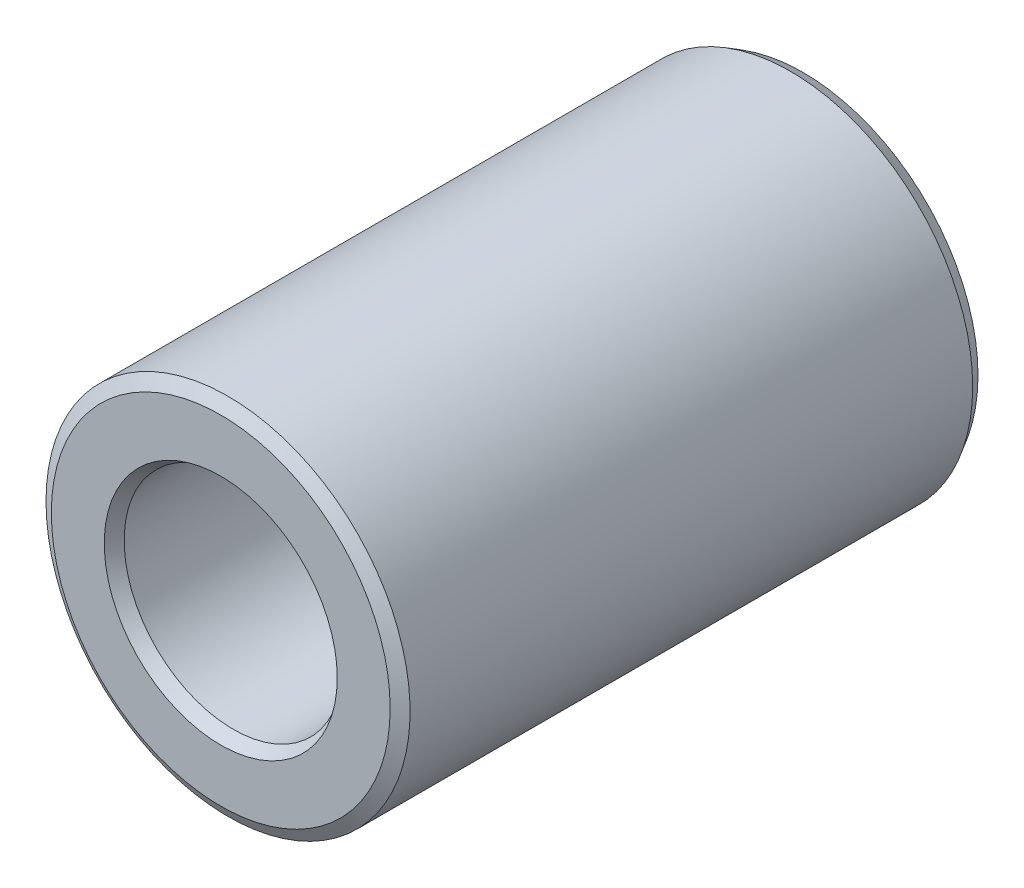
ISO-10303-21;
HEADER;
FILE_DESCRIPTION(('STEP AP214'),'2;1');
FILE_NAME('part.step','',(''),(''),'','','');
FILE_SCHEMA(('AUTOMOTIVE_DESIGN { 1 0 10303 214 1 1 1 1 }'));
ENDSEC;
DATA;
#1=APPLICATION_CONTEXT('core data for automotive mechanical design processes');
#2=APPLICATION_PROTOCOL_DEFINITION('international standard','automotive_design',2000,#1);
#3=PRODUCT_CONTEXT('',#1,'mechanical');
#4=PRODUCT('Part','Part','',(#3));
#5=PRODUCT_RELATED_PRODUCT_CATEGORY('part','',(#4));
#6=PRODUCT_DEFINITION_FORMATION('','',#4);
#7=PRODUCT_DEFINITION_CONTEXT('part definition',#1,'design');
#8=PRODUCT_DEFINITION('design','',#6,#7);
#9=PRODUCT_DEFINITION_SHAPE('','',#8);
#10=(LENGTH_UNIT() NAMED_UNIT(*) SI_UNIT(.MILLI.,.METRE.));
#11=(NAMED_UNIT(*) PLANE_ANGLE_UNIT() SI_UNIT($,.RADIAN.));
#12=(NAMED_UNIT(*) SI_UNIT($,.STERADIAN.) SOLID_ANGLE_UNIT());
#13=UNCERTAINTY_MEASURE_WITH_UNIT(LENGTH_MEASURE(1.E-05),#10,'distance_accuracy_value','');
#14=(GEOMETRIC_REPRESENTATION_CONTEXT(3) GLOBAL_UNCERTAINTY_ASSIGNED_CONTEXT((#13)) GLOBAL_UNIT_ASSIGNED_CONTEXT((#10,
#11,#12)) REPRESENTATION_CONTEXT('',''));
#15=CARTESIAN_POINT('',(0.,0.,0.));
#16=DIRECTION('',(0.,0.,1.));
#17=DIRECTION('',(1.,0.,0.));
#18=AXIS2_PLACEMENT_3D('',#15,#16,#17);
#19=CARTESIAN_POINT('',(0.,0.,4.));
#20=DIRECTION('',(0.,0.,1.));
#21=DIRECTION('',(1.,0.,0.));
#22=AXIS2_PLACEMENT_3D('',#19,#20,#21);
#23=PLANE('',#22);
#24=CARTESIAN_POINT('',(0.,0.,4.));
#25=DIRECTION('',(0.,0.,1.));
#26=DIRECTION('',(1.,0.,0.));
#27=AXIS2_PLACEMENT_3D('',#24,#25,#26);
#28=CIRCLE('',#27,1.6);
#29=CARTESIAN_POINT('',(1.6,0.,4.));
#30=VERTEX_POINT('',#29);
#31=EDGE_CURVE('E10',#30,#30,#28,.F.);
#32=ORIENTED_EDGE('',*,*,#31,.T.);
#33=EDGE_LOOP('',(#32));
#34=FACE_BOUND('',#33,.T.);
#35=CARTESIAN_POINT('',(0.,0.,4.));
#36=DIRECTION('',(0.,0.,1.));
#37=DIRECTION('',(1.,0.,0.));
#38=AXIS2_PLACEMENT_3D('',#35,#36,#37);
#39=CIRCLE('',#38,2.32679491924311);
#40=CARTESIAN_POINT('',(-2.32679491924311,0.,4.));
#41=VERTEX_POINT('',#40);
#42=EDGE_CURVE('E51',#41,#41,#39,.T.);
#43=ORIENTED_EDGE('',*,*,#42,.T.);
#44=EDGE_LOOP('',(#43));
#45=FACE_BOUND('',#44,.T.);
#46=ADVANCED_FACE('F43',(#34,#45),#23,.T.);
#47=CARTESIAN_POINT('',(0.,0.,-4.));
#48=DIRECTION('',(0.,0.,1.));
#49=DIRECTION('',(1.,0.,0.));
#50=AXIS2_PLACEMENT_3D('',#47,#48,#49);
#51=PLANE('',#50);
#52=CARTESIAN_POINT('',(0.,0.,-4.));
#53=DIRECTION('',(0.,0.,1.));
#54=DIRECTION('',(1.,0.,0.));
#55=AXIS2_PLACEMENT_3D('',#52,#53,#54);
#56=CIRCLE('',#55,1.67320508075689);
#57=CARTESIAN_POINT('',(1.67320508075689,0.,-4.));
#58=VERTEX_POINT('',#57);
#59=EDGE_CURVE('E67',#58,#58,#56,.T.);
#60=ORIENTED_EDGE('',*,*,#59,.T.);
#61=EDGE_LOOP('',(#60));
#62=FACE_BOUND('',#61,.T.);
#63=CARTESIAN_POINT('',(0.,0.,-4.));
#64=DIRECTION('',(0.,0.,1.));
#65=DIRECTION('',(1.,0.,0.));
#66=AXIS2_PLACEMENT_3D('',#63,#64,#65);
#67=CIRCLE('',#66,2.4);
#68=CARTESIAN_POINT('',(2.4,0.,-4.));
#69=VERTEX_POINT('',#68);
#70=EDGE_CURVE('E71',#69,#69,#67,.F.);
#71=ORIENTED_EDGE('',*,*,#70,.T.);
#72=EDGE_LOOP('',(#71));
#73=FACE_BOUND('',#72,.T.);
#74=ADVANCED_FACE('F80',(#62,#73),#51,.F.);
#75=CARTESIAN_POINT('',(0.,0.,4.));
#76=DIRECTION('',(0.,0.,-1.));
#77=DIRECTION('',(-1.,0.,0.));
#78=AXIS2_PLACEMENT_3D('',#75,#76,#77);
#79=CYLINDRICAL_SURFACE('',#78,2.5);
#80=CARTESIAN_POINT('',(0.,0.,-3.82679491924311));
#81=DIRECTION('',(0.,0.,1.));
#82=DIRECTION('',(1.,0.,0.));
#83=AXIS2_PLACEMENT_3D('',#80,#81,#82);
#84=CIRCLE('',#83,2.5);
#85=CARTESIAN_POINT('',(-2.5,0.,-3.82679491924311));
#86=VERTEX_POINT('',#85);
#87=EDGE_CURVE('E54',#86,#86,#84,.T.);
#88=CARTESIAN_POINT('',(0.,0.,3.9));
#89=DIRECTION('',(0.,0.,1.));
#90=DIRECTION('',(1.,0.,0.));
#91=AXIS2_PLACEMENT_3D('',#88,#89,#90);
#92=CIRCLE('',#91,2.5);
#93=CARTESIAN_POINT('',(-2.5,0.,3.9));
#94=VERTEX_POINT('',#93);
#95=EDGE_CURVE('E56',#94,#94,#92,.F.);
#96=CARTESIAN_POINT('',(-2.5,0.,-3.82679491924311));
#97=CARTESIAN_POINT('',(-2.5,0.,-3.74630747216766));
#98=CARTESIAN_POINT('',(-2.5,0.,-3.66582002509221));
#99=CARTESIAN_POINT('',(-2.5,0.,-3.50484513094131));
#100=CARTESIAN_POINT('',(-2.5,0.,-3.42435768386586));
#101=CARTESIAN_POINT('',(-2.5,0.,-3.26338278971496));
#102=CARTESIAN_POINT('',(-2.5,0.,-3.18289534263951));
#103=CARTESIAN_POINT('',(-2.5,0.,-3.02192044848862));
#104=CARTESIAN_POINT('',(-2.5,0.,-2.94143300141317));
#105=CARTESIAN_POINT('',(-2.5,0.,-2.78045810726227));
#106=CARTESIAN_POINT('',(-2.5,0.,-2.69997066018682));
#107=CARTESIAN_POINT('',(-2.5,0.,-2.53899576603592));
#108=CARTESIAN_POINT('',(-2.5,0.,-2.45850831896047));
#109=CARTESIAN_POINT('',(-2.5,0.,-2.29753342480958));
#110=CARTESIAN_POINT('',(-2.5,0.,-2.21704597773413));
#111=CARTESIAN_POINT('',(-2.5,0.,-2.05607108358323));
#112=CARTESIAN_POINT('',(-2.5,0.,-1.97558363650778));
#113=CARTESIAN_POINT('',(-2.5,0.,-1.81460874235688));
#114=CARTESIAN_POINT('',(-2.5,0.,-1.73412129528143));
#115=CARTESIAN_POINT('',(-2.5,0.,-1.57314640113053));
#116=CARTESIAN_POINT('',(-2.5,0.,-1.49265895405508));
#117=CARTESIAN_POINT('',(-2.5,0.,-1.33168405990419));
#118=CARTESIAN_POINT('',(-2.5,0.,-1.25119661282874));
#119=CARTESIAN_POINT('',(-2.5,0.,-1.09022171867784));
#120=CARTESIAN_POINT('',(-2.5,0.,-1.00973427160239));
#121=CARTESIAN_POINT('',(-2.5,0.,-0.848759377451492));
#122=CARTESIAN_POINT('',(-2.5,0.,-0.768271930376043));
#123=CARTESIAN_POINT('',(-2.5,0.,-0.607297036225145));
#124=CARTESIAN_POINT('',(-2.5,0.,-0.526809589149696));
#125=CARTESIAN_POINT('',(-2.5,0.,-0.365834694998798));
#126=CARTESIAN_POINT('',(-2.5,0.,-0.285347247923349));
#127=CARTESIAN_POINT('',(-2.5,0.,-0.124372353772451));
#128=CARTESIAN_POINT('',(-2.5,0.,-0.043884906697002));
#129=CARTESIAN_POINT('',(-2.5,0.,0.117089987453896));
#130=CARTESIAN_POINT('',(-2.5,0.,0.197577434529345));
#131=CARTESIAN_POINT('',(-2.5,0.,0.358552328680242));
#132=CARTESIAN_POINT('',(-2.5,0.,0.439039775755691));
#133=CARTESIAN_POINT('',(-2.5,0.,0.600014669906589));
#134=CARTESIAN_POINT('',(-2.5,0.,0.680502116982038));
#135=CARTESIAN_POINT('',(-2.5,0.,0.841477011132936));
#136=CARTESIAN_POINT('',(-2.5,0.,0.921964458208386));
#137=CARTESIAN_POINT('',(-2.5,0.,1.08293935235928));
#138=CARTESIAN_POINT('',(-2.5,0.,1.16342679943473));
#139=CARTESIAN_POINT('',(-2.5,0.,1.32440169358563));
#140=CARTESIAN_POINT('',(-2.5,0.,1.40488914066108));
#141=CARTESIAN_POINT('',(-2.5,0.,1.56586403481198));
#142=CARTESIAN_POINT('',(-2.5,0.,1.64635148188743));
#143=CARTESIAN_POINT('',(-2.5,0.,1.80732637603832));
#144=CARTESIAN_POINT('',(-2.5,0.,1.88781382311377));
#145=CARTESIAN_POINT('',(-2.5,0.,2.04878871726467));
#146=CARTESIAN_POINT('',(-2.5,0.,2.12927616434012));
#147=CARTESIAN_POINT('',(-2.5,0.,2.29025105849102));
#148=CARTESIAN_POINT('',(-2.5,0.,2.37073850556647));
#149=CARTESIAN_POINT('',(-2.5,0.,2.53171339971737));
#150=CARTESIAN_POINT('',(-2.5,0.,2.61220084679282));
#151=CARTESIAN_POINT('',(-2.5,0.,2.77317574094371));
#152=CARTESIAN_POINT('',(-2.5,0.,2.85366318801916));
#153=CARTESIAN_POINT('',(-2.5,0.,3.01463808217006));
#154=CARTESIAN_POINT('',(-2.5,0.,3.09512552924551));
#155=CARTESIAN_POINT('',(-2.5,0.,3.25610042339641));
#156=CARTESIAN_POINT('',(-2.5,0.,3.33658787047186));
#157=CARTESIAN_POINT('',(-2.5,0.,3.49756276462275));
#158=CARTESIAN_POINT('',(-2.5,0.,3.5780502116982));
#159=CARTESIAN_POINT('',(-2.5,0.,3.7390251058491));
#160=CARTESIAN_POINT('',(-2.5,0.,3.81951255292455));
#161=CARTESIAN_POINT('',(-2.5,0.,3.9));
#162=B_SPLINE_CURVE_WITH_KNOTS('',3,(#96,#97,#98,#99,#100,#101,#102,#103,#104,#105,#106,#107,
#108,#109,#110,#111,#112,#113,#114,#115,#116,#117,#118,#119,#120,#121,#122,#123,#124,#125,#126,
#127,#128,#129,#130,#131,#132,#133,#134,#135,#136,#137,#138,#139,#140,#141,#142,#143,#144,#145,
#146,#147,#148,#149,#150,#151,#152,#153,#154,#155,#156,#157,#158,#159,#160,#161),.UNSPECIFIED.,
.F.,.F.,(4,2,2,2,2,2,2,2,2,2,2,2,2,2,2,2,2,2,2,2,2,2,2,2,2,2,2,2,2,2,2,2,4),(0.,
0.241462341226347,0.482924682452694,0.724387023679041,0.965849364905388,1.20731170613174,
1.44877404735808,1.69023638858443,1.93169872981078,2.17316107103712,2.41462341226347,
2.65608575348982,2.89754809471617,3.13901043594251,3.38047277716886,3.62193511839521,
3.86339745962155,4.1048598008479,4.34632214207425,4.58778448330059,4.82924682452694,
5.07070916575329,5.31217150697964,5.55363384820598,5.79509618943233,6.03655853065868,
6.27802087188502,6.51948321311137,6.76094555433772,7.00240789556407,7.24387023679041,
7.48533257801676,7.72679491924311),.UNSPECIFIED.);
#163=EDGE_CURVE('BSEAM87',#86,#94,#162,.T.);
#164=ORIENTED_EDGE('',*,*,#87,.T.);
#165=ORIENTED_EDGE('',*,*,#95,.T.);
#166=ORIENTED_EDGE('',*,*,#163,.T.);
#167=ORIENTED_EDGE('',*,*,#163,.F.);
#168=EDGE_LOOP('',(#164,#166,#165,#167));
#169=FACE_BOUND('',#168,.T.);
#170=ADVANCED_FACE('F87',(#169),#79,.T.);
#171=CARTESIAN_POINT('',(0.,0.,4.));
#172=DIRECTION('',(0.,0.,-1.));
#173=DIRECTION('',(-1.,0.,0.));
#174=AXIS2_PLACEMENT_3D('',#171,#172,#173);
#175=CYLINDRICAL_SURFACE('',#174,1.5);
#176=CARTESIAN_POINT('',(0.,0.,-3.9));
#177=DIRECTION('',(0.,0.,1.));
#178=DIRECTION('',(1.,0.,0.));
#179=AXIS2_PLACEMENT_3D('',#176,#177,#178);
#180=CIRCLE('',#179,1.5);
#181=CARTESIAN_POINT('',(1.5,0.,-3.9));
#182=VERTEX_POINT('',#181);
#183=EDGE_CURVE('E61',#182,#182,#180,.F.);
#184=ORIENTED_EDGE('',*,*,#183,.T.);
#185=EDGE_LOOP('',(#184));
#186=FACE_BOUND('',#185,.T.);
#187=CARTESIAN_POINT('',(0.,0.,3.82679491924312));
#188=DIRECTION('',(0.,0.,1.));
#189=DIRECTION('',(1.,0.,0.));
#190=AXIS2_PLACEMENT_3D('',#187,#188,#189);
#191=CIRCLE('',#190,1.5);
#192=CARTESIAN_POINT('',(1.5,0.,3.82679491924312));
#193=VERTEX_POINT('',#192);
#194=EDGE_CURVE('E70',#193,#193,#191,.T.);
#195=ORIENTED_EDGE('',*,*,#194,.T.);
#196=EDGE_LOOP('',(#195));
#197=FACE_BOUND('',#196,.T.);
#198=ADVANCED_FACE('F89',(#186,#197),#175,.F.);
#199=CARTESIAN_POINT('',(0.,0.,-4.));
#200=DIRECTION('',(0.,0.,-1.));
#201=DIRECTION('',(-1.,0.,0.));
#202=AXIS2_PLACEMENT_3D('',#199,#200,#201);
#203=CONICAL_SURFACE('',#202,1.67320508075689,1.0471975511966);
#204=ORIENTED_EDGE('',*,*,#183,.F.);
#205=EDGE_LOOP('',(#204));
#206=FACE_BOUND('',#205,.T.);
#207=ORIENTED_EDGE('',*,*,#59,.F.);
#208=EDGE_LOOP('',(#207));
#209=FACE_BOUND('',#208,.T.);
#210=ADVANCED_FACE('F81',(#206,#209),#203,.F.);
#211=CARTESIAN_POINT('',(0.,0.,-3.82679491924311));
#212=DIRECTION('',(0.,0.,1.));
#213=DIRECTION('',(1.,0.,0.));
#214=AXIS2_PLACEMENT_3D('',#211,#212,#213);
#215=CONICAL_SURFACE('',#214,2.5,0.523598775598293);
#216=ORIENTED_EDGE('',*,*,#70,.F.);
#217=EDGE_LOOP('',(#216));
#218=FACE_BOUND('',#217,.T.);
#219=ORIENTED_EDGE('',*,*,#87,.F.);
#220=EDGE_LOOP('',(#219));
#221=FACE_BOUND('',#220,.T.);
#222=ADVANCED_FACE('F76',(#218,#221),#215,.T.);
#223=CARTESIAN_POINT('',(0.,0.,3.82679491924312));
#224=DIRECTION('',(0.,0.,1.));
#225=DIRECTION('',(1.,0.,0.));
#226=AXIS2_PLACEMENT_3D('',#223,#224,#225);
#227=CONICAL_SURFACE('',#226,1.5,0.523598775598298);
#228=ORIENTED_EDGE('',*,*,#31,.F.);
#229=EDGE_LOOP('',(#228));
#230=FACE_BOUND('',#229,.T.);
#231=ORIENTED_EDGE('',*,*,#194,.F.);
#232=EDGE_LOOP('',(#231));
#233=FACE_BOUND('',#232,.T.);
#234=ADVANCED_FACE('F85',(#230,#233),#227,.F.);
#235=CARTESIAN_POINT('',(0.,0.,4.));
#236=DIRECTION('',(0.,0.,-1.));
#237=DIRECTION('',(-1.,0.,0.));
#238=AXIS2_PLACEMENT_3D('',#235,#236,#237);
#239=CONICAL_SURFACE('',#238,2.32679491924311,1.04719755119659);
#240=CARTESIAN_POINT('',(-2.5,0.,3.9));
#241=CARTESIAN_POINT('',(-2.49819578040878,0.,3.90104166666667));
#242=CARTESIAN_POINT('',(-2.49639156081757,0.,3.90208333333333));
#243=CARTESIAN_POINT('',(-2.49278312163513,0.,3.90416666666667));
#244=CARTESIAN_POINT('',(-2.49097890204391,0.,3.90520833333333));
#245=CARTESIAN_POINT('',(-2.48737046286148,0.,3.90729166666667));
#246=CARTESIAN_POINT('',(-2.48556624327026,0.,3.90833333333333));
#247=CARTESIAN_POINT('',(-2.48195780408782,0.,3.91041666666667));
#248=CARTESIAN_POINT('',(-2.48015358449661,0.,3.91145833333333));
#249=CARTESIAN_POINT('',(-2.47654514531417,0.,3.91354166666667));
#250=CARTESIAN_POINT('',(-2.47474092572295,0.,3.91458333333333));
#251=CARTESIAN_POINT('',(-2.47113248654052,0.,3.91666666666667));
#252=CARTESIAN_POINT('',(-2.4693282669493,0.,3.91770833333333));
#253=CARTESIAN_POINT('',(-2.46571982776687,0.,3.91979166666667));
#254=CARTESIAN_POINT('',(-2.46391560817565,0.,3.92083333333333));
#255=CARTESIAN_POINT('',(-2.46030716899321,0.,3.92291666666667));
#256=CARTESIAN_POINT('',(-2.458502949402,0.,3.92395833333333));
#257=CARTESIAN_POINT('',(-2.45489451021956,0.,3.92604166666667));
#258=CARTESIAN_POINT('',(-2.45309029062834,0.,3.92708333333333));
#259=CARTESIAN_POINT('',(-2.44948185144591,0.,3.92916666666667));
#260=CARTESIAN_POINT('',(-2.44767763185469,0.,3.93020833333333));
#261=CARTESIAN_POINT('',(-2.44406919267226,0.,3.93229166666667));
#262=CARTESIAN_POINT('',(-2.44226497308104,0.,3.93333333333333));
#263=CARTESIAN_POINT('',(-2.4386565338986,0.,3.93541666666667));
#264=CARTESIAN_POINT('',(-2.43685231430739,0.,3.93645833333333));
#265=CARTESIAN_POINT('',(-2.43324387512495,0.,3.93854166666667));
#266=CARTESIAN_POINT('',(-2.43143965553373,0.,3.93958333333333));
#267=CARTESIAN_POINT('',(-2.4278312163513,0.,3.94166666666667));
#268=CARTESIAN_POINT('',(-2.42602699676008,0.,3.94270833333333));
#269=CARTESIAN_POINT('',(-2.42241855757765,0.,3.94479166666667));
#270=CARTESIAN_POINT('',(-2.42061433798643,0.,3.94583333333333));
#271=CARTESIAN_POINT('',(-2.41700589880399,0.,3.94791666666667));
#272=CARTESIAN_POINT('',(-2.41520167921278,0.,3.94895833333333));
#273=CARTESIAN_POINT('',(-2.41159324003034,0.,3.95104166666667));
#274=CARTESIAN_POINT('',(-2.40978902043912,0.,3.95208333333333));
#275=CARTESIAN_POINT('',(-2.40618058125669,0.,3.95416666666667));
#276=CARTESIAN_POINT('',(-2.40437636166547,0.,3.95520833333333));
#277=CARTESIAN_POINT('',(-2.40076792248303,0.,3.95729166666667));
#278=CARTESIAN_POINT('',(-2.39896370289182,0.,3.95833333333333));
#279=CARTESIAN_POINT('',(-2.39535526370938,0.,3.96041666666667));
#280=CARTESIAN_POINT('',(-2.39355104411816,0.,3.96145833333333));
#281=CARTESIAN_POINT('',(-2.38994260493573,0.,3.96354166666667));
#282=CARTESIAN_POINT('',(-2.38813838534451,0.,3.96458333333333));
#283=CARTESIAN_POINT('',(-2.38452994616208,0.,3.96666666666667));
#284=CARTESIAN_POINT('',(-2.38272572657086,0.,3.96770833333333));
#285=CARTESIAN_POINT('',(-2.37911728738842,0.,3.96979166666667));
#286=CARTESIAN_POINT('',(-2.37731306779721,0.,3.97083333333333));
#287=CARTESIAN_POINT('',(-2.37370462861477,0.,3.97291666666667));
#288=CARTESIAN_POINT('',(-2.37190040902355,0.,3.97395833333333));
#289=CARTESIAN_POINT('',(-2.36829196984112,0.,3.97604166666667));
#290=CARTESIAN_POINT('',(-2.3664877502499,0.,3.97708333333333));
#291=CARTESIAN_POINT('',(-2.36287931106747,0.,3.97916666666667));
#292=CARTESIAN_POINT('',(-2.36107509147625,0.,3.98020833333333));
#293=CARTESIAN_POINT('',(-2.35746665229381,0.,3.98229166666667));
#294=CARTESIAN_POINT('',(-2.3556624327026,0.,3.98333333333333));
#295=CARTESIAN_POINT('',(-2.35205399352016,0.,3.98541666666667));
#296=CARTESIAN_POINT('',(-2.35024977392894,0.,3.98645833333333));
#297=CARTESIAN_POINT('',(-2.34664133474651,0.,3.98854166666667));
#298=CARTESIAN_POINT('',(-2.34483711515529,0.,3.98958333333333));
#299=CARTESIAN_POINT('',(-2.34122867597286,0.,3.99166666666667));
#300=CARTESIAN_POINT('',(-2.33942445638164,0.,3.99270833333333));
#301=CARTESIAN_POINT('',(-2.3358160171992,0.,3.99479166666667));
#302=CARTESIAN_POINT('',(-2.33401179760798,0.,3.99583333333333));
#303=CARTESIAN_POINT('',(-2.33040335842555,0.,3.99791666666667));
#304=CARTESIAN_POINT('',(-2.32859913883433,0.,3.99895833333333));
#305=CARTESIAN_POINT('',(-2.32679491924311,0.,4.));
#306=B_SPLINE_CURVE_WITH_KNOTS('',3,(#240,#241,#242,#243,#244,#245,#246,#247,#248,#249,#250,
#251,#252,#253,#254,#255,#256,#257,#258,#259,#260,#261,#262,#263,#264,#265,#266,#267,#268,#269,
#270,#271,#272,#273,#274,#275,#276,#277,#278,#279,#280,#281,#282,#283,#284,#285,#286,#287,#288,
#289,#290,#291,#292,#293,#294,#295,#296,#297,#298,#299,#300,#301,#302,#303,#304,#305),
.UNSPECIFIED.,.F.,.F.,(4,2,2,2,2,2,2,2,2,2,2,2,2,2,2,2,2,2,2,2,2,2,2,2,2,2,2,2,2,2,2,2,4),(0.,
0.0062499999999997,0.0124999999999996,0.0187499999999997,0.0249999999999998,0.0312499999999995,
0.0374999999999997,0.0437499999999994,0.0499999999999994,0.0562499999999996,0.0624999999999993,
0.068749999999999,0.0749999999999991,0.0812499999999992,0.0874999999999993,0.093749999999999,
0.0999999999999987,0.106249999999999,0.112499999999999,0.118749999999999,0.124999999999999,
0.131249999999998,0.137499999999999,0.143749999999999,0.149999999999998,0.156249999999998,
0.162499999999998,0.168749999999998,0.174999999999998,0.181249999999998,0.187499999999998,
0.193749999999998,0.199999999999998),.UNSPECIFIED.);
#307=EDGE_CURVE('BSEAM46',#94,#41,#306,.T.);
#308=ORIENTED_EDGE('',*,*,#95,.F.);
#309=ORIENTED_EDGE('',*,*,#42,.F.);
#310=ORIENTED_EDGE('',*,*,#307,.T.);
#311=ORIENTED_EDGE('',*,*,#307,.F.);
#312=EDGE_LOOP('',(#308,#310,#309,#311));
#313=FACE_BOUND('',#312,.T.);
#314=ADVANCED_FACE('F46',(#313),#239,.T.);
#315=CLOSED_SHELL('',(#46,#74,#170,#198,#210,#222,#234,#314));
#316=MANIFOLD_SOLID_BREP('B2',#315);
#317=ADVANCED_BREP_SHAPE_REPRESENTATION('',(#18,#316),#14);
#318=SHAPE_DEFINITION_REPRESENTATION(#9,#317);
ENDSEC;
END-ISO-10303-21;
